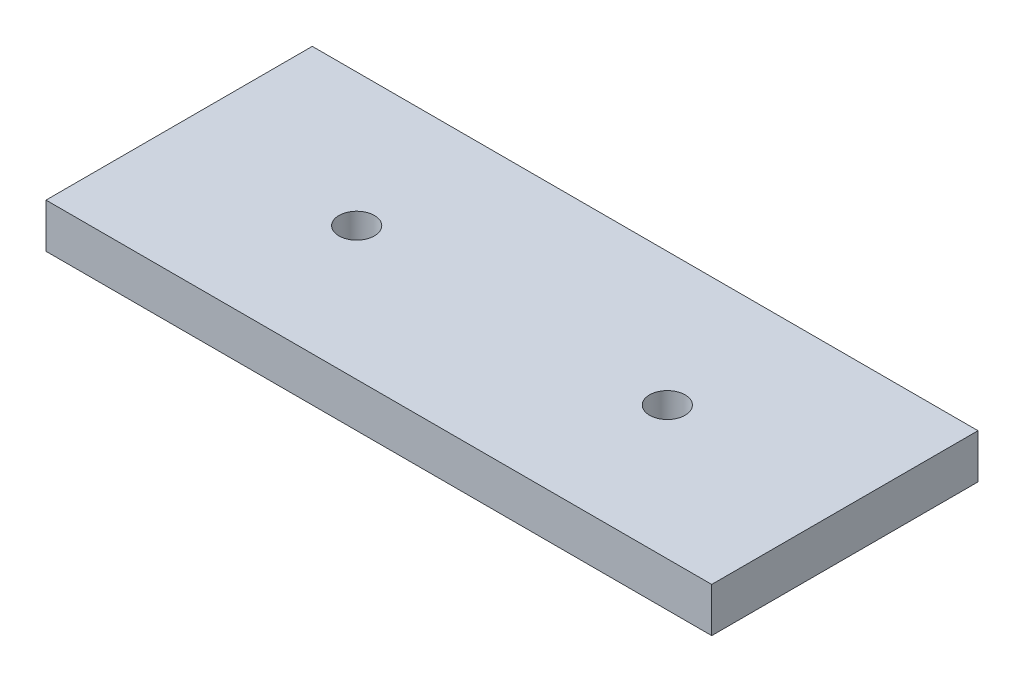
ISO-10303-21;
HEADER;
FILE_DESCRIPTION(('STEP AP214'),'2;1');
FILE_NAME('part.step','',(''),(''),'','','');
FILE_SCHEMA(('AUTOMOTIVE_DESIGN { 1 0 10303 214 1 1 1 1 }'));
ENDSEC;
DATA;
#1=APPLICATION_CONTEXT('core data for automotive mechanical design processes');
#2=APPLICATION_PROTOCOL_DEFINITION('international standard','automotive_design',2000,#1);
#3=PRODUCT_CONTEXT('',#1,'mechanical');
#4=PRODUCT('Part','Part','',(#3));
#5=PRODUCT_RELATED_PRODUCT_CATEGORY('part','',(#4));
#6=PRODUCT_DEFINITION_FORMATION('','',#4);
#7=PRODUCT_DEFINITION_CONTEXT('part definition',#1,'design');
#8=PRODUCT_DEFINITION('design','',#6,#7);
#9=PRODUCT_DEFINITION_SHAPE('','',#8);
#10=(LENGTH_UNIT() NAMED_UNIT(*) SI_UNIT(.MILLI.,.METRE.));
#11=(NAMED_UNIT(*) PLANE_ANGLE_UNIT() SI_UNIT($,.RADIAN.));
#12=(NAMED_UNIT(*) SI_UNIT($,.STERADIAN.) SOLID_ANGLE_UNIT());
#13=UNCERTAINTY_MEASURE_WITH_UNIT(LENGTH_MEASURE(1.E-05),#10,'distance_accuracy_value','');
#14=(GEOMETRIC_REPRESENTATION_CONTEXT(3) GLOBAL_UNCERTAINTY_ASSIGNED_CONTEXT((#13)) GLOBAL_UNIT_ASSIGNED_CONTEXT((#10,
#11,#12)) REPRESENTATION_CONTEXT('',''));
#15=CARTESIAN_POINT('',(0.,0.,0.));
#16=DIRECTION('',(0.,0.,1.));
#17=DIRECTION('',(1.,0.,0.));
#18=AXIS2_PLACEMENT_3D('',#15,#16,#17);
#19=CARTESIAN_POINT('',(0.,5.,0.));
#20=DIRECTION('',(0.,1.,0.));
#21=DIRECTION('',(0.,0.,1.));
#22=AXIS2_PLACEMENT_3D('',#19,#20,#21);
#23=PLANE('',#22);
#24=CARTESIAN_POINT('',(20.,5.,15.));
#25=DIRECTION('',(0.,1.,0.));
#26=DIRECTION('',(0.,0.,1.));
#27=AXIS2_PLACEMENT_3D('',#24,#25,#26);
#28=CIRCLE('',#27,2.);
#29=CARTESIAN_POINT('',(20.,5.,17.));
#30=VERTEX_POINT('',#29);
#31=EDGE_CURVE('E112',#30,#30,#28,.T.);
#32=ORIENTED_EDGE('',*,*,#31,.F.);
#33=EDGE_LOOP('',(#32));
#34=FACE_BOUND('',#33,.T.);
#35=DIRECTION('',(0.,0.,1.));
#36=VECTOR('',#35,1.);
#37=CARTESIAN_POINT('',(0.,5.,0.));
#38=LINE('',#37,#36);
#39=CARTESIAN_POINT('',(0.,5.,0.));
#40=VERTEX_POINT('',#39);
#41=CARTESIAN_POINT('',(0.,5.,30.));
#42=VERTEX_POINT('',#41);
#43=EDGE_CURVE('E92',#40,#42,#38,.T.);
#44=ORIENTED_EDGE('',*,*,#43,.T.);
#45=DIRECTION('',(1.,0.,0.));
#46=VECTOR('',#45,1.);
#47=CARTESIAN_POINT('',(0.,5.,30.));
#48=LINE('',#47,#46);
#49=CARTESIAN_POINT('',(75.,5.,30.));
#50=VERTEX_POINT('',#49);
#51=EDGE_CURVE('E87',#42,#50,#48,.T.);
#52=ORIENTED_EDGE('',*,*,#51,.T.);
#53=DIRECTION('',(0.,0.,-1.));
#54=VECTOR('',#53,1.);
#55=CARTESIAN_POINT('',(75.,5.,0.));
#56=LINE('',#55,#54);
#57=CARTESIAN_POINT('',(75.,5.,0.));
#58=VERTEX_POINT('',#57);
#59=EDGE_CURVE('E90',#50,#58,#56,.T.);
#60=ORIENTED_EDGE('',*,*,#59,.T.);
#61=DIRECTION('',(-1.,0.,0.));
#62=VECTOR('',#61,1.);
#63=CARTESIAN_POINT('',(0.,5.,0.));
#64=LINE('',#63,#62);
#65=EDGE_CURVE('E57',#58,#40,#64,.T.);
#66=ORIENTED_EDGE('',*,*,#65,.T.);
#67=EDGE_LOOP('',(#44,#52,#60,#66));
#68=FACE_BOUND('',#67,.T.);
#69=CARTESIAN_POINT('',(55.,5.,15.));
#70=DIRECTION('',(0.,1.,0.));
#71=DIRECTION('',(0.,0.,1.));
#72=AXIS2_PLACEMENT_3D('',#69,#70,#71);
#73=CIRCLE('',#72,2.);
#74=CARTESIAN_POINT('',(55.,5.,17.));
#75=VERTEX_POINT('',#74);
#76=EDGE_CURVE('E134',#75,#75,#73,.T.);
#77=ORIENTED_EDGE('',*,*,#76,.F.);
#78=EDGE_LOOP('',(#77));
#79=FACE_BOUND('',#78,.T.);
#80=ADVANCED_FACE('F39',(#34,#68,#79),#23,.T.);
#81=CARTESIAN_POINT('',(0.,0.,0.));
#82=DIRECTION('',(0.,1.,0.));
#83=DIRECTION('',(0.,0.,1.));
#84=AXIS2_PLACEMENT_3D('',#81,#82,#83);
#85=PLANE('',#84);
#86=DIRECTION('',(0.,0.,1.));
#87=VECTOR('',#86,1.);
#88=CARTESIAN_POINT('',(0.,0.,0.));
#89=LINE('',#88,#87);
#90=CARTESIAN_POINT('',(0.,0.,0.));
#91=VERTEX_POINT('',#90);
#92=CARTESIAN_POINT('',(0.,0.,30.));
#93=VERTEX_POINT('',#92);
#94=EDGE_CURVE('E108',#91,#93,#89,.T.);
#95=ORIENTED_EDGE('',*,*,#94,.F.);
#96=DIRECTION('',(-1.,0.,0.));
#97=VECTOR('',#96,1.);
#98=CARTESIAN_POINT('',(0.,0.,0.));
#99=LINE('',#98,#97);
#100=CARTESIAN_POINT('',(75.,0.,0.));
#101=VERTEX_POINT('',#100);
#102=EDGE_CURVE('E80',#101,#91,#99,.T.);
#103=ORIENTED_EDGE('',*,*,#102,.F.);
#104=DIRECTION('',(0.,0.,-1.));
#105=VECTOR('',#104,1.);
#106=CARTESIAN_POINT('',(75.,0.,0.));
#107=LINE('',#106,#105);
#108=CARTESIAN_POINT('',(75.,0.,30.));
#109=VERTEX_POINT('',#108);
#110=EDGE_CURVE('E74',#109,#101,#107,.T.);
#111=ORIENTED_EDGE('',*,*,#110,.F.);
#112=DIRECTION('',(1.,0.,0.));
#113=VECTOR('',#112,1.);
#114=CARTESIAN_POINT('',(0.,0.,30.));
#115=LINE('',#114,#113);
#116=EDGE_CURVE('E97',#93,#109,#115,.T.);
#117=ORIENTED_EDGE('',*,*,#116,.F.);
#118=EDGE_LOOP('',(#95,#103,#111,#117));
#119=FACE_BOUND('',#118,.T.);
#120=CARTESIAN_POINT('',(20.,0.,15.));
#121=DIRECTION('',(0.,1.,0.));
#122=DIRECTION('',(0.,0.,1.));
#123=AXIS2_PLACEMENT_3D('',#120,#121,#122);
#124=CIRCLE('',#123,2.);
#125=CARTESIAN_POINT('',(20.,0.,17.));
#126=VERTEX_POINT('',#125);
#127=EDGE_CURVE('E130',#126,#126,#124,.T.);
#128=ORIENTED_EDGE('',*,*,#127,.T.);
#129=EDGE_LOOP('',(#128));
#130=FACE_BOUND('',#129,.T.);
#131=CARTESIAN_POINT('',(55.,0.,15.));
#132=DIRECTION('',(0.,1.,0.));
#133=DIRECTION('',(0.,0.,1.));
#134=AXIS2_PLACEMENT_3D('',#131,#132,#133);
#135=CIRCLE('',#134,2.);
#136=CARTESIAN_POINT('',(55.,0.,17.));
#137=VERTEX_POINT('',#136);
#138=EDGE_CURVE('E138',#137,#137,#135,.T.);
#139=ORIENTED_EDGE('',*,*,#138,.T.);
#140=EDGE_LOOP('',(#139));
#141=FACE_BOUND('',#140,.T.);
#142=ADVANCED_FACE('F125',(#119,#130,#141),#85,.F.);
#143=CARTESIAN_POINT('',(0.,5.,0.));
#144=DIRECTION('',(1.,0.,0.));
#145=DIRECTION('',(0.,0.,-1.));
#146=AXIS2_PLACEMENT_3D('',#143,#144,#145);
#147=PLANE('',#146);
#148=ORIENTED_EDGE('',*,*,#94,.T.);
#149=DIRECTION('',(0.,-1.,0.));
#150=VECTOR('',#149,1.);
#151=CARTESIAN_POINT('',(0.,5.,30.));
#152=LINE('',#151,#150);
#153=EDGE_CURVE('E11',#42,#93,#152,.T.);
#154=ORIENTED_EDGE('',*,*,#153,.F.);
#155=ORIENTED_EDGE('',*,*,#43,.F.);
#156=DIRECTION('',(0.,-1.,0.));
#157=VECTOR('',#156,1.);
#158=CARTESIAN_POINT('',(0.,5.,0.));
#159=LINE('',#158,#157);
#160=EDGE_CURVE('E104',#40,#91,#159,.T.);
#161=ORIENTED_EDGE('',*,*,#160,.T.);
#162=EDGE_LOOP('',(#148,#154,#155,#161));
#163=FACE_BOUND('',#162,.T.);
#164=ADVANCED_FACE('F41',(#163),#147,.F.);
#165=CARTESIAN_POINT('',(0.,5.,30.));
#166=DIRECTION('',(0.,0.,-1.));
#167=DIRECTION('',(-1.,0.,0.));
#168=AXIS2_PLACEMENT_3D('',#165,#166,#167);
#169=PLANE('',#168);
#170=ORIENTED_EDGE('',*,*,#116,.T.);
#171=DIRECTION('',(0.,-1.,0.));
#172=VECTOR('',#171,1.);
#173=CARTESIAN_POINT('',(75.,5.,30.));
#174=LINE('',#173,#172);
#175=EDGE_CURVE('E49',#50,#109,#174,.T.);
#176=ORIENTED_EDGE('',*,*,#175,.F.);
#177=ORIENTED_EDGE('',*,*,#51,.F.);
#178=ORIENTED_EDGE('',*,*,#153,.T.);
#179=EDGE_LOOP('',(#170,#176,#177,#178));
#180=FACE_BOUND('',#179,.T.);
#181=ADVANCED_FACE('F96',(#180),#169,.F.);
#182=CARTESIAN_POINT('',(75.,5.,0.));
#183=DIRECTION('',(-1.,0.,0.));
#184=DIRECTION('',(0.,0.,1.));
#185=AXIS2_PLACEMENT_3D('',#182,#183,#184);
#186=PLANE('',#185);
#187=ORIENTED_EDGE('',*,*,#110,.T.);
#188=DIRECTION('',(0.,-1.,0.));
#189=VECTOR('',#188,1.);
#190=CARTESIAN_POINT('',(75.,5.,0.));
#191=LINE('',#190,#189);
#192=EDGE_CURVE('E99',#58,#101,#191,.T.);
#193=ORIENTED_EDGE('',*,*,#192,.F.);
#194=ORIENTED_EDGE('',*,*,#59,.F.);
#195=ORIENTED_EDGE('',*,*,#175,.T.);
#196=EDGE_LOOP('',(#187,#193,#194,#195));
#197=FACE_BOUND('',#196,.T.);
#198=ADVANCED_FACE('F100',(#197),#186,.F.);
#199=CARTESIAN_POINT('',(0.,5.,0.));
#200=DIRECTION('',(0.,0.,1.));
#201=DIRECTION('',(1.,0.,0.));
#202=AXIS2_PLACEMENT_3D('',#199,#200,#201);
#203=PLANE('',#202);
#204=ORIENTED_EDGE('',*,*,#102,.T.);
#205=ORIENTED_EDGE('',*,*,#160,.F.);
#206=ORIENTED_EDGE('',*,*,#65,.F.);
#207=ORIENTED_EDGE('',*,*,#192,.T.);
#208=EDGE_LOOP('',(#204,#205,#206,#207));
#209=FACE_BOUND('',#208,.T.);
#210=ADVANCED_FACE('F122',(#209),#203,.F.);
#211=CARTESIAN_POINT('',(20.,5.,15.));
#212=DIRECTION('',(0.,-1.,0.));
#213=DIRECTION('',(0.,0.,-1.));
#214=AXIS2_PLACEMENT_3D('',#211,#212,#213);
#215=CYLINDRICAL_SURFACE('',#214,2.);
#216=ORIENTED_EDGE('',*,*,#31,.T.);
#217=EDGE_LOOP('',(#216));
#218=FACE_BOUND('',#217,.T.);
#219=ORIENTED_EDGE('',*,*,#127,.F.);
#220=EDGE_LOOP('',(#219));
#221=FACE_BOUND('',#220,.T.);
#222=ADVANCED_FACE('F157',(#218,#221),#215,.F.);
#223=CARTESIAN_POINT('',(55.,5.,15.));
#224=DIRECTION('',(0.,-1.,0.));
#225=DIRECTION('',(0.,0.,-1.));
#226=AXIS2_PLACEMENT_3D('',#223,#224,#225);
#227=CYLINDRICAL_SURFACE('',#226,2.);
#228=ORIENTED_EDGE('',*,*,#76,.T.);
#229=EDGE_LOOP('',(#228));
#230=FACE_BOUND('',#229,.T.);
#231=ORIENTED_EDGE('',*,*,#138,.F.);
#232=EDGE_LOOP('',(#231));
#233=FACE_BOUND('',#232,.T.);
#234=ADVANCED_FACE('F146',(#230,#233),#227,.F.);
#235=CLOSED_SHELL('',(#80,#142,#164,#181,#198,#210,#222,#234));
#236=MANIFOLD_SOLID_BREP('B2',#235);
#237=ADVANCED_BREP_SHAPE_REPRESENTATION('',(#18,#236),#14);
#238=SHAPE_DEFINITION_REPRESENTATION(#9,#237);
ENDSEC;
END-ISO-10303-21;
